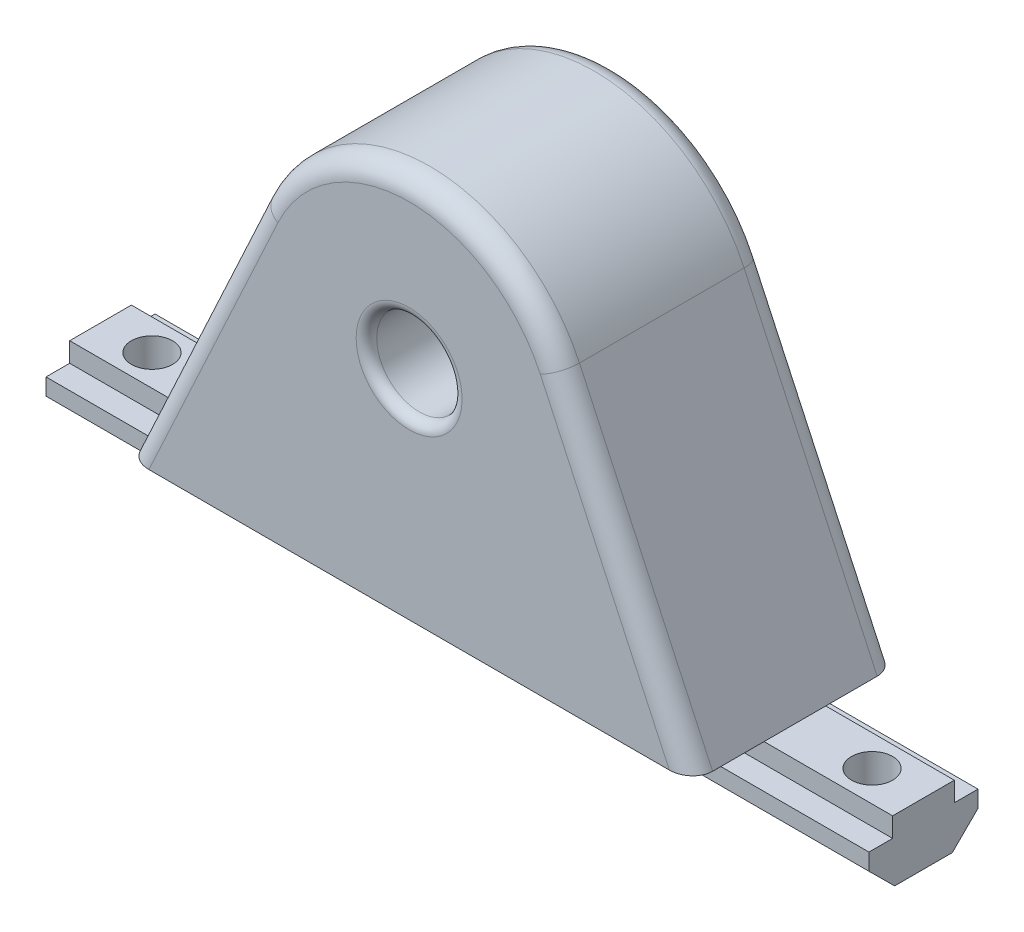
ISO-10303-21;
HEADER;
FILE_DESCRIPTION(('STEP AP214'),'2;1');
FILE_NAME('part.step','',(''),(''),'','','');
FILE_SCHEMA(('AUTOMOTIVE_DESIGN { 1 0 10303 214 1 1 1 1 }'));
ENDSEC;
DATA;
#1=APPLICATION_CONTEXT('core data for automotive mechanical design processes');
#2=APPLICATION_PROTOCOL_DEFINITION('international standard','automotive_design',2000,#1);
#3=PRODUCT_CONTEXT('',#1,'mechanical');
#4=PRODUCT('Part','Part','',(#3));
#5=PRODUCT_RELATED_PRODUCT_CATEGORY('part','',(#4));
#6=PRODUCT_DEFINITION_FORMATION('','',#4);
#7=PRODUCT_DEFINITION_CONTEXT('part definition',#1,'design');
#8=PRODUCT_DEFINITION('design','',#6,#7);
#9=PRODUCT_DEFINITION_SHAPE('','',#8);
#10=(LENGTH_UNIT() NAMED_UNIT(*) SI_UNIT(.MILLI.,.METRE.));
#11=(NAMED_UNIT(*) PLANE_ANGLE_UNIT() SI_UNIT($,.RADIAN.));
#12=(NAMED_UNIT(*) SI_UNIT($,.STERADIAN.) SOLID_ANGLE_UNIT());
#13=UNCERTAINTY_MEASURE_WITH_UNIT(LENGTH_MEASURE(1.E-05),#10,'distance_accuracy_value','');
#14=(GEOMETRIC_REPRESENTATION_CONTEXT(3) GLOBAL_UNCERTAINTY_ASSIGNED_CONTEXT((#13)) GLOBAL_UNIT_ASSIGNED_CONTEXT((#10,
#11,#12)) REPRESENTATION_CONTEXT('',''));
#15=CARTESIAN_POINT('',(0.,0.,0.));
#16=DIRECTION('',(0.,0.,1.));
#17=DIRECTION('',(1.,0.,0.));
#18=AXIS2_PLACEMENT_3D('',#15,#16,#17);
#19=CARTESIAN_POINT('',(40.,6.,3.));
#20=DIRECTION('',(0.,-1.,0.));
#21=DIRECTION('',(0.,0.,-1.));
#22=AXIS2_PLACEMENT_3D('',#19,#20,#21);
#23=PLANE('',#22);
#24=CARTESIAN_POINT('',(35.,6.,0.));
#25=DIRECTION('',(0.,1.,0.));
#26=DIRECTION('',(0.,0.,1.));
#27=AXIS2_PLACEMENT_3D('',#24,#25,#26);
#28=CIRCLE('',#27,2.);
#29=CARTESIAN_POINT('',(35.,6.,2.));
#30=VERTEX_POINT('',#29);
#31=EDGE_CURVE('E405',#30,#30,#28,.T.);
#32=ORIENTED_EDGE('',*,*,#31,.F.);
#33=EDGE_LOOP('',(#32));
#34=FACE_BOUND('',#33,.T.);
#35=DIRECTION('',(0.,0.,-1.));
#36=VECTOR('',#35,1.);
#37=CARTESIAN_POINT('',(27.5,6.,10.));
#38=LINE('',#37,#36);
#39=CARTESIAN_POINT('',(27.5,6.,3.));
#40=VERTEX_POINT('',#39);
#41=CARTESIAN_POINT('',(27.5,6.,-3.));
#42=VERTEX_POINT('',#41);
#43=EDGE_CURVE('E219',#40,#42,#38,.T.);
#44=ORIENTED_EDGE('',*,*,#43,.F.);
#45=DIRECTION('',(-1.,0.,0.));
#46=VECTOR('',#45,1.);
#47=CARTESIAN_POINT('',(40.,6.,3.));
#48=LINE('',#47,#46);
#49=CARTESIAN_POINT('',(40.,6.,3.));
#50=VERTEX_POINT('',#49);
#51=EDGE_CURVE('E227',#50,#40,#48,.T.);
#52=ORIENTED_EDGE('',*,*,#51,.F.);
#53=DIRECTION('',(0.,0.,1.));
#54=VECTOR('',#53,1.);
#55=CARTESIAN_POINT('',(40.,6.,3.));
#56=LINE('',#55,#54);
#57=CARTESIAN_POINT('',(40.,6.,-3.));
#58=VERTEX_POINT('',#57);
#59=EDGE_CURVE('E465',#58,#50,#56,.T.);
#60=ORIENTED_EDGE('',*,*,#59,.F.);
#61=DIRECTION('',(-1.,0.,0.));
#62=VECTOR('',#61,1.);
#63=CARTESIAN_POINT('',(40.,6.,-3.));
#64=LINE('',#63,#62);
#65=EDGE_CURVE('E209',#58,#42,#64,.T.);
#66=ORIENTED_EDGE('',*,*,#65,.T.);
#67=EDGE_LOOP('',(#44,#52,#60,#66));
#68=FACE_BOUND('',#67,.T.);
#69=ADVANCED_FACE('F43',(#34,#68),#23,.F.);
#70=CARTESIAN_POINT('',(40.,6.,3.));
#71=DIRECTION('',(0.,0.,-1.));
#72=DIRECTION('',(-1.,0.,0.));
#73=AXIS2_PLACEMENT_3D('',#70,#71,#72);
#74=PLANE('',#73);
#75=DIRECTION('',(0.,-1.,0.));
#76=VECTOR('',#75,1.);
#77=CARTESIAN_POINT('',(-40.,6.,3.));
#78=LINE('',#77,#76);
#79=CARTESIAN_POINT('',(-40.,6.,3.));
#80=VERTEX_POINT('',#79);
#81=CARTESIAN_POINT('',(-40.,4.1,3.));
#82=VERTEX_POINT('',#81);
#83=EDGE_CURVE('E435',#80,#82,#78,.T.);
#84=ORIENTED_EDGE('',*,*,#83,.T.);
#85=DIRECTION('',(-1.,0.,0.));
#86=VECTOR('',#85,1.);
#87=CARTESIAN_POINT('',(40.,4.1,3.));
#88=LINE('',#87,#86);
#89=CARTESIAN_POINT('',(40.,4.1,3.));
#90=VERTEX_POINT('',#89);
#91=EDGE_CURVE('E220',#90,#82,#88,.T.);
#92=ORIENTED_EDGE('',*,*,#91,.F.);
#93=DIRECTION('',(0.,-1.,0.));
#94=VECTOR('',#93,1.);
#95=CARTESIAN_POINT('',(40.,6.,3.));
#96=LINE('',#95,#94);
#97=EDGE_CURVE('E436',#50,#90,#96,.T.);
#98=ORIENTED_EDGE('',*,*,#97,.F.);
#99=ORIENTED_EDGE('',*,*,#51,.T.);
#100=CARTESIAN_POINT('',(-27.5,5.99999999999999,3.));
#101=VERTEX_POINT('',#100);
#102=EDGE_CURVE('E230',#40,#101,#48,.T.);
#103=ORIENTED_EDGE('',*,*,#102,.T.);
#104=EDGE_CURVE('E216',#101,#80,#48,.T.);
#105=ORIENTED_EDGE('',*,*,#104,.T.);
#106=EDGE_LOOP('',(#84,#92,#98,#99,#103,#105));
#107=FACE_BOUND('',#106,.T.);
#108=ADVANCED_FACE('F371',(#107),#74,.F.);
#109=CARTESIAN_POINT('',(40.,4.1,3.));
#110=DIRECTION('',(0.,-1.,0.));
#111=DIRECTION('',(0.,0.,-1.));
#112=AXIS2_PLACEMENT_3D('',#109,#110,#111);
#113=PLANE('',#112);
#114=DIRECTION('',(0.,0.,1.));
#115=VECTOR('',#114,1.);
#116=CARTESIAN_POINT('',(-40.,4.1,3.));
#117=LINE('',#116,#115);
#118=CARTESIAN_POINT('',(-40.,4.1,5.3));
#119=VERTEX_POINT('',#118);
#120=EDGE_CURVE('E471',#82,#119,#117,.T.);
#121=ORIENTED_EDGE('',*,*,#120,.T.);
#122=DIRECTION('',(-1.,0.,0.));
#123=VECTOR('',#122,1.);
#124=CARTESIAN_POINT('',(40.,4.1,5.3));
#125=LINE('',#124,#123);
#126=CARTESIAN_POINT('',(40.,4.1,5.3));
#127=VERTEX_POINT('',#126);
#128=EDGE_CURVE('E262',#127,#119,#125,.T.);
#129=ORIENTED_EDGE('',*,*,#128,.F.);
#130=DIRECTION('',(0.,0.,1.));
#131=VECTOR('',#130,1.);
#132=CARTESIAN_POINT('',(40.,4.1,3.));
#133=LINE('',#132,#131);
#134=EDGE_CURVE('E440',#90,#127,#133,.T.);
#135=ORIENTED_EDGE('',*,*,#134,.F.);
#136=ORIENTED_EDGE('',*,*,#91,.T.);
#137=EDGE_LOOP('',(#121,#129,#135,#136));
#138=FACE_BOUND('',#137,.T.);
#139=ADVANCED_FACE('F378',(#138),#113,.F.);
#140=CARTESIAN_POINT('',(40.,4.1,5.3));
#141=DIRECTION('',(0.,0.,-1.));
#142=DIRECTION('',(-1.,0.,0.));
#143=AXIS2_PLACEMENT_3D('',#140,#141,#142);
#144=PLANE('',#143);
#145=DIRECTION('',(0.,-1.,0.));
#146=VECTOR('',#145,1.);
#147=CARTESIAN_POINT('',(-40.,4.1,5.3));
#148=LINE('',#147,#146);
#149=CARTESIAN_POINT('',(-40.,2.48,5.3));
#150=VERTEX_POINT('',#149);
#151=EDGE_CURVE('E474',#119,#150,#148,.T.);
#152=ORIENTED_EDGE('',*,*,#151,.T.);
#153=DIRECTION('',(-1.,0.,0.));
#154=VECTOR('',#153,1.);
#155=CARTESIAN_POINT('',(40.,2.48,5.3));
#156=LINE('',#155,#154);
#157=CARTESIAN_POINT('',(40.,2.48,5.3));
#158=VERTEX_POINT('',#157);
#159=EDGE_CURVE('E258',#158,#150,#156,.T.);
#160=ORIENTED_EDGE('',*,*,#159,.F.);
#161=DIRECTION('',(0.,-1.,0.));
#162=VECTOR('',#161,1.);
#163=CARTESIAN_POINT('',(40.,4.1,5.3));
#164=LINE('',#163,#162);
#165=EDGE_CURVE('E444',#127,#158,#164,.T.);
#166=ORIENTED_EDGE('',*,*,#165,.F.);
#167=ORIENTED_EDGE('',*,*,#128,.T.);
#168=EDGE_LOOP('',(#152,#160,#166,#167));
#169=FACE_BOUND('',#168,.T.);
#170=ADVANCED_FACE('F682',(#169),#144,.F.);
#171=CARTESIAN_POINT('',(40.,0.,2.8));
#172=DIRECTION('',(0.,0.709940842242428,-0.704261315504488));
#173=DIRECTION('',(0.,0.704261315504488,0.709940842242428));
#174=AXIS2_PLACEMENT_3D('',#171,#172,#173);
#175=PLANE('',#174);
#176=DIRECTION('',(0.,-0.704261315504488,-0.709940842242428));
#177=VECTOR('',#176,1.);
#178=CARTESIAN_POINT('',(-40.,0.,2.8));
#179=LINE('',#178,#177);
#180=CARTESIAN_POINT('',(-40.,0.,2.8));
#181=VERTEX_POINT('',#180);
#182=EDGE_CURVE('E477',#150,#181,#179,.T.);
#183=ORIENTED_EDGE('',*,*,#182,.T.);
#184=DIRECTION('',(-1.,0.,0.));
#185=VECTOR('',#184,1.);
#186=CARTESIAN_POINT('',(40.,0.,2.8));
#187=LINE('',#186,#185);
#188=CARTESIAN_POINT('',(40.,0.,2.8));
#189=VERTEX_POINT('',#188);
#190=EDGE_CURVE('E254',#189,#181,#187,.T.);
#191=ORIENTED_EDGE('',*,*,#190,.F.);
#192=DIRECTION('',(0.,-0.704261315504488,-0.709940842242428));
#193=VECTOR('',#192,1.);
#194=CARTESIAN_POINT('',(40.,0.,2.8));
#195=LINE('',#194,#193);
#196=EDGE_CURVE('E447',#158,#189,#195,.T.);
#197=ORIENTED_EDGE('',*,*,#196,.F.);
#198=ORIENTED_EDGE('',*,*,#159,.T.);
#199=EDGE_LOOP('',(#183,#191,#197,#198));
#200=FACE_BOUND('',#199,.T.);
#201=ADVANCED_FACE('F686',(#200),#175,.F.);
#202=CARTESIAN_POINT('',(40.,0.,2.8));
#203=DIRECTION('',(0.,1.,0.));
#204=DIRECTION('',(0.,0.,1.));
#205=AXIS2_PLACEMENT_3D('',#202,#203,#204);
#206=PLANE('',#205);
#207=CARTESIAN_POINT('',(35.,0.,0.));
#208=DIRECTION('',(0.,1.,0.));
#209=DIRECTION('',(0.,0.,1.));
#210=AXIS2_PLACEMENT_3D('',#207,#208,#209);
#211=CIRCLE('',#210,2.);
#212=CARTESIAN_POINT('',(35.,0.,2.));
#213=VERTEX_POINT('',#212);
#214=EDGE_CURVE('E329',#213,#213,#211,.T.);
#215=ORIENTED_EDGE('',*,*,#214,.T.);
#216=EDGE_LOOP('',(#215));
#217=FACE_BOUND('',#216,.T.);
#218=CARTESIAN_POINT('',(-35.,0.,0.));
#219=DIRECTION('',(0.,1.,0.));
#220=DIRECTION('',(0.,0.,1.));
#221=AXIS2_PLACEMENT_3D('',#218,#219,#220);
#222=CIRCLE('',#221,2.);
#223=CARTESIAN_POINT('',(-35.,0.,2.));
#224=VERTEX_POINT('',#223);
#225=EDGE_CURVE('E401',#224,#224,#222,.T.);
#226=ORIENTED_EDGE('',*,*,#225,.T.);
#227=EDGE_LOOP('',(#226));
#228=FACE_BOUND('',#227,.T.);
#229=DIRECTION('',(0.,0.,-1.));
#230=VECTOR('',#229,1.);
#231=CARTESIAN_POINT('',(-40.,0.,2.8));
#232=LINE('',#231,#230);
#233=CARTESIAN_POINT('',(-40.,0.,-2.8));
#234=VERTEX_POINT('',#233);
#235=EDGE_CURVE('E480',#181,#234,#232,.T.);
#236=ORIENTED_EDGE('',*,*,#235,.T.);
#237=DIRECTION('',(-1.,0.,0.));
#238=VECTOR('',#237,1.);
#239=CARTESIAN_POINT('',(40.,0.,-2.8));
#240=LINE('',#239,#238);
#241=CARTESIAN_POINT('',(40.,0.,-2.8));
#242=VERTEX_POINT('',#241);
#243=EDGE_CURVE('E250',#242,#234,#240,.T.);
#244=ORIENTED_EDGE('',*,*,#243,.F.);
#245=DIRECTION('',(0.,0.,-1.));
#246=VECTOR('',#245,1.);
#247=CARTESIAN_POINT('',(40.,0.,2.8));
#248=LINE('',#247,#246);
#249=EDGE_CURVE('E450',#189,#242,#248,.T.);
#250=ORIENTED_EDGE('',*,*,#249,.F.);
#251=ORIENTED_EDGE('',*,*,#190,.T.);
#252=EDGE_LOOP('',(#236,#244,#250,#251));
#253=FACE_BOUND('',#252,.T.);
#254=ADVANCED_FACE('F690',(#217,#228,#253),#206,.F.);
#255=CARTESIAN_POINT('',(40.,0.,-2.8));
#256=DIRECTION('',(0.,0.709940842242428,0.704261315504488));
#257=DIRECTION('',(0.,-0.704261315504488,0.709940842242428));
#258=AXIS2_PLACEMENT_3D('',#255,#256,#257);
#259=PLANE('',#258);
#260=DIRECTION('',(0.,0.704261315504488,-0.709940842242428));
#261=VECTOR('',#260,1.);
#262=CARTESIAN_POINT('',(-40.,0.,-2.8));
#263=LINE('',#262,#261);
#264=CARTESIAN_POINT('',(-40.,2.48,-5.3));
#265=VERTEX_POINT('',#264);
#266=EDGE_CURVE('E483',#234,#265,#263,.T.);
#267=ORIENTED_EDGE('',*,*,#266,.T.);
#268=DIRECTION('',(-1.,0.,0.));
#269=VECTOR('',#268,1.);
#270=CARTESIAN_POINT('',(40.,2.48,-5.3));
#271=LINE('',#270,#269);
#272=CARTESIAN_POINT('',(40.,2.48,-5.3));
#273=VERTEX_POINT('',#272);
#274=EDGE_CURVE('E244',#273,#265,#271,.T.);
#275=ORIENTED_EDGE('',*,*,#274,.F.);
#276=DIRECTION('',(0.,0.704261315504488,-0.709940842242428));
#277=VECTOR('',#276,1.);
#278=CARTESIAN_POINT('',(40.,0.,-2.8));
#279=LINE('',#278,#277);
#280=EDGE_CURVE('E453',#242,#273,#279,.T.);
#281=ORIENTED_EDGE('',*,*,#280,.F.);
#282=ORIENTED_EDGE('',*,*,#243,.T.);
#283=EDGE_LOOP('',(#267,#275,#281,#282));
#284=FACE_BOUND('',#283,.T.);
#285=ADVANCED_FACE('F693',(#284),#259,.F.);
#286=CARTESIAN_POINT('',(40.,4.1,-5.3));
#287=DIRECTION('',(0.,0.,1.));
#288=DIRECTION('',(1.,0.,0.));
#289=AXIS2_PLACEMENT_3D('',#286,#287,#288);
#290=PLANE('',#289);
#291=DIRECTION('',(0.,1.,0.));
#292=VECTOR('',#291,1.);
#293=CARTESIAN_POINT('',(-40.,4.1,-5.3));
#294=LINE('',#293,#292);
#295=CARTESIAN_POINT('',(-40.,4.1,-5.3));
#296=VERTEX_POINT('',#295);
#297=EDGE_CURVE('E486',#265,#296,#294,.T.);
#298=ORIENTED_EDGE('',*,*,#297,.T.);
#299=DIRECTION('',(-1.,0.,0.));
#300=VECTOR('',#299,1.);
#301=CARTESIAN_POINT('',(40.,4.1,-5.3));
#302=LINE('',#301,#300);
#303=CARTESIAN_POINT('',(40.,4.1,-5.3));
#304=VERTEX_POINT('',#303);
#305=EDGE_CURVE('E239',#304,#296,#302,.T.);
#306=ORIENTED_EDGE('',*,*,#305,.F.);
#307=DIRECTION('',(0.,1.,0.));
#308=VECTOR('',#307,1.);
#309=CARTESIAN_POINT('',(40.,4.1,-5.3));
#310=LINE('',#309,#308);
#311=EDGE_CURVE('E456',#273,#304,#310,.T.);
#312=ORIENTED_EDGE('',*,*,#311,.F.);
#313=ORIENTED_EDGE('',*,*,#274,.T.);
#314=EDGE_LOOP('',(#298,#306,#312,#313));
#315=FACE_BOUND('',#314,.T.);
#316=ADVANCED_FACE('F697',(#315),#290,.F.);
#317=CARTESIAN_POINT('',(40.,4.1,-3.));
#318=DIRECTION('',(0.,-1.,0.));
#319=DIRECTION('',(0.,0.,-1.));
#320=AXIS2_PLACEMENT_3D('',#317,#318,#319);
#321=PLANE('',#320);
#322=DIRECTION('',(0.,0.,1.));
#323=VECTOR('',#322,1.);
#324=CARTESIAN_POINT('',(-40.,4.1,-3.));
#325=LINE('',#324,#323);
#326=CARTESIAN_POINT('',(-40.,4.1,-3.));
#327=VERTEX_POINT('',#326);
#328=EDGE_CURVE('E489',#296,#327,#325,.T.);
#329=ORIENTED_EDGE('',*,*,#328,.T.);
#330=DIRECTION('',(-1.,0.,0.));
#331=VECTOR('',#330,1.);
#332=CARTESIAN_POINT('',(40.,4.1,-3.));
#333=LINE('',#332,#331);
#334=CARTESIAN_POINT('',(40.,4.1,-3.));
#335=VERTEX_POINT('',#334);
#336=EDGE_CURVE('E234',#335,#327,#333,.T.);
#337=ORIENTED_EDGE('',*,*,#336,.F.);
#338=DIRECTION('',(0.,0.,1.));
#339=VECTOR('',#338,1.);
#340=CARTESIAN_POINT('',(40.,4.1,-3.));
#341=LINE('',#340,#339);
#342=EDGE_CURVE('E459',#304,#335,#341,.T.);
#343=ORIENTED_EDGE('',*,*,#342,.F.);
#344=ORIENTED_EDGE('',*,*,#305,.T.);
#345=EDGE_LOOP('',(#329,#337,#343,#344));
#346=FACE_BOUND('',#345,.T.);
#347=ADVANCED_FACE('F395',(#346),#321,.F.);
#348=CARTESIAN_POINT('',(40.,6.,-3.));
#349=DIRECTION('',(0.,0.,1.));
#350=DIRECTION('',(0.,-1.,0.));
#351=AXIS2_PLACEMENT_3D('',#348,#349,#350);
#352=PLANE('',#351);
#353=DIRECTION('',(0.,1.,0.));
#354=VECTOR('',#353,1.);
#355=CARTESIAN_POINT('',(-40.,6.,-3.));
#356=LINE('',#355,#354);
#357=CARTESIAN_POINT('',(-40.,6.,-3.));
#358=VERTEX_POINT('',#357);
#359=EDGE_CURVE('E224',#327,#358,#356,.T.);
#360=ORIENTED_EDGE('',*,*,#359,.T.);
#361=CARTESIAN_POINT('',(-27.5,5.99999999999999,-3.));
#362=VERTEX_POINT('',#361);
#363=EDGE_CURVE('E210',#362,#358,#64,.T.);
#364=ORIENTED_EDGE('',*,*,#363,.F.);
#365=EDGE_CURVE('E200',#42,#362,#64,.T.);
#366=ORIENTED_EDGE('',*,*,#365,.F.);
#367=ORIENTED_EDGE('',*,*,#65,.F.);
#368=DIRECTION('',(0.,1.,0.));
#369=VECTOR('',#368,1.);
#370=CARTESIAN_POINT('',(40.,6.,-3.));
#371=LINE('',#370,#369);
#372=EDGE_CURVE('E462',#335,#58,#371,.T.);
#373=ORIENTED_EDGE('',*,*,#372,.F.);
#374=ORIENTED_EDGE('',*,*,#336,.T.);
#375=EDGE_LOOP('',(#360,#364,#366,#367,#373,#374));
#376=FACE_BOUND('',#375,.T.);
#377=ADVANCED_FACE('F221',(#376),#352,.F.);
#378=CARTESIAN_POINT('',(-35.,6.,0.));
#379=DIRECTION('',(0.,1.,0.));
#380=DIRECTION('',(0.,0.,1.));
#381=AXIS2_PLACEMENT_3D('',#378,#379,#380);
#382=CIRCLE('',#381,2.);
#383=CARTESIAN_POINT('',(-35.,6.,2.));
#384=VERTEX_POINT('',#383);
#385=EDGE_CURVE('E398',#384,#384,#382,.T.);
#386=ORIENTED_EDGE('',*,*,#385,.F.);
#387=EDGE_LOOP('',(#386));
#388=FACE_BOUND('',#387,.T.);
#389=ORIENTED_EDGE('',*,*,#104,.F.);
#390=DIRECTION('',(0.,0.,-1.));
#391=VECTOR('',#390,1.);
#392=CARTESIAN_POINT('',(-27.5,5.99999999999999,10.));
#393=LINE('',#392,#391);
#394=EDGE_CURVE('E188',#101,#362,#393,.T.);
#395=ORIENTED_EDGE('',*,*,#394,.T.);
#396=ORIENTED_EDGE('',*,*,#363,.T.);
#397=DIRECTION('',(0.,0.,1.));
#398=VECTOR('',#397,1.);
#399=CARTESIAN_POINT('',(-40.,6.,3.));
#400=LINE('',#399,#398);
#401=EDGE_CURVE('E441',#358,#80,#400,.T.);
#402=ORIENTED_EDGE('',*,*,#401,.T.);
#403=EDGE_LOOP('',(#389,#395,#396,#402));
#404=FACE_BOUND('',#403,.T.);
#405=ADVANCED_FACE('F213',(#388,#404),#23,.F.);
#406=CARTESIAN_POINT('',(40.,0.,0.));
#407=DIRECTION('',(-1.,0.,0.));
#408=DIRECTION('',(0.,0.,1.));
#409=AXIS2_PLACEMENT_3D('',#406,#407,#408);
#410=PLANE('',#409);
#411=ORIENTED_EDGE('',*,*,#97,.T.);
#412=ORIENTED_EDGE('',*,*,#134,.T.);
#413=ORIENTED_EDGE('',*,*,#165,.T.);
#414=ORIENTED_EDGE('',*,*,#196,.T.);
#415=ORIENTED_EDGE('',*,*,#249,.T.);
#416=ORIENTED_EDGE('',*,*,#280,.T.);
#417=ORIENTED_EDGE('',*,*,#311,.T.);
#418=ORIENTED_EDGE('',*,*,#342,.T.);
#419=ORIENTED_EDGE('',*,*,#372,.T.);
#420=ORIENTED_EDGE('',*,*,#59,.T.);
#421=EDGE_LOOP('',(#411,#412,#413,#414,#415,#416,#417,#418,#419,#420));
#422=FACE_BOUND('',#421,.T.);
#423=ADVANCED_FACE('F385',(#422),#410,.F.);
#424=CARTESIAN_POINT('',(-40.,0.,0.));
#425=DIRECTION('',(-1.,0.,0.));
#426=DIRECTION('',(0.,0.,1.));
#427=AXIS2_PLACEMENT_3D('',#424,#425,#426);
#428=PLANE('',#427);
#429=ORIENTED_EDGE('',*,*,#83,.F.);
#430=ORIENTED_EDGE('',*,*,#401,.F.);
#431=ORIENTED_EDGE('',*,*,#359,.F.);
#432=ORIENTED_EDGE('',*,*,#328,.F.);
#433=ORIENTED_EDGE('',*,*,#297,.F.);
#434=ORIENTED_EDGE('',*,*,#266,.F.);
#435=ORIENTED_EDGE('',*,*,#235,.F.);
#436=ORIENTED_EDGE('',*,*,#182,.F.);
#437=ORIENTED_EDGE('',*,*,#151,.F.);
#438=ORIENTED_EDGE('',*,*,#120,.F.);
#439=EDGE_LOOP('',(#429,#430,#431,#432,#433,#434,#435,#436,#437,#438));
#440=FACE_BOUND('',#439,.T.);
#441=ADVANCED_FACE('F391',(#440),#428,.T.);
#442=CARTESIAN_POINT('',(27.5,6.,10.));
#443=DIRECTION('',(0.,1.,0.));
#444=DIRECTION('',(-1.,0.,0.));
#445=AXIS2_PLACEMENT_3D('',#442,#443,#444);
#446=PLANE('',#445);
#447=CARTESIAN_POINT('',(-27.5,5.99999999999999,-8.));
#448=VERTEX_POINT('',#447);
#449=EDGE_CURVE('E183',#362,#448,#393,.T.);
#450=ORIENTED_EDGE('',*,*,#449,.T.);
#451=CARTESIAN_POINT('',(-25.2954077045284,5.99999999999999,-8.));
#452=DIRECTION('',(0.,1.,0.));
#453=DIRECTION('',(-1.,0.,0.));
#454=AXIS2_PLACEMENT_3D('',#451,#452,#453);
#455=ELLIPSE('',#454,2.20459229547155,2.);
#456=CARTESIAN_POINT('',(-25.2954077045284,5.99999999999999,-10.));
#457=VERTEX_POINT('',#456);
#458=EDGE_CURVE('E313',#448,#457,#455,.F.);
#459=ORIENTED_EDGE('',*,*,#458,.T.);
#460=DIRECTION('',(1.,0.,0.));
#461=VECTOR('',#460,1.);
#462=CARTESIAN_POINT('',(27.5,6.,-10.));
#463=LINE('',#462,#461);
#464=CARTESIAN_POINT('',(25.2954077045285,6.,-10.));
#465=VERTEX_POINT('',#464);
#466=EDGE_CURVE('E421',#457,#465,#463,.T.);
#467=ORIENTED_EDGE('',*,*,#466,.T.);
#468=CARTESIAN_POINT('',(25.2954077045285,6.,-8.));
#469=DIRECTION('',(0.,1.,0.));
#470=DIRECTION('',(-1.,0.,0.));
#471=AXIS2_PLACEMENT_3D('',#468,#469,#470);
#472=ELLIPSE('',#471,2.20459229547155,2.);
#473=CARTESIAN_POINT('',(27.5,6.,-8.));
#474=VERTEX_POINT('',#473);
#475=EDGE_CURVE('E310',#465,#474,#472,.F.);
#476=ORIENTED_EDGE('',*,*,#475,.T.);
#477=EDGE_CURVE('E203',#42,#474,#38,.T.);
#478=ORIENTED_EDGE('',*,*,#477,.F.);
#479=ORIENTED_EDGE('',*,*,#365,.T.);
#480=EDGE_LOOP('',(#450,#459,#467,#476,#478,#479));
#481=FACE_BOUND('',#480,.T.);
#482=ADVANCED_FACE('F201',(#481),#446,.F.);
#483=CARTESIAN_POINT('',(27.5,6.,8.));
#484=VERTEX_POINT('',#483);
#485=EDGE_CURVE('E196',#484,#40,#38,.T.);
#486=ORIENTED_EDGE('',*,*,#485,.F.);
#487=CARTESIAN_POINT('',(25.2954077045285,5.99999999999999,8.));
#488=DIRECTION('',(0.,1.,0.));
#489=DIRECTION('',(1.,0.,0.));
#490=AXIS2_PLACEMENT_3D('',#487,#488,#489);
#491=ELLIPSE('',#490,2.20459229547155,2.);
#492=CARTESIAN_POINT('',(25.2954077045285,6.,10.));
#493=VERTEX_POINT('',#492);
#494=EDGE_CURVE('E279',#484,#493,#491,.F.);
#495=ORIENTED_EDGE('',*,*,#494,.T.);
#496=DIRECTION('',(1.,0.,0.));
#497=VECTOR('',#496,1.);
#498=CARTESIAN_POINT('',(27.5,6.,10.));
#499=LINE('',#498,#497);
#500=CARTESIAN_POINT('',(-25.2954077045284,5.99999999999999,10.));
#501=VERTEX_POINT('',#500);
#502=EDGE_CURVE('E425',#501,#493,#499,.T.);
#503=ORIENTED_EDGE('',*,*,#502,.F.);
#504=CARTESIAN_POINT('',(-25.2954077045284,5.99999999999999,8.));
#505=DIRECTION('',(0.,1.,0.));
#506=DIRECTION('',(1.,0.,0.));
#507=AXIS2_PLACEMENT_3D('',#504,#505,#506);
#508=ELLIPSE('',#507,2.20459229547155,2.);
#509=CARTESIAN_POINT('',(-27.5,5.99999999999999,8.));
#510=VERTEX_POINT('',#509);
#511=EDGE_CURVE('E276',#501,#510,#508,.F.);
#512=ORIENTED_EDGE('',*,*,#511,.T.);
#513=EDGE_CURVE('E195',#510,#101,#393,.T.);
#514=ORIENTED_EDGE('',*,*,#513,.T.);
#515=ORIENTED_EDGE('',*,*,#102,.F.);
#516=EDGE_LOOP('',(#486,#495,#503,#512,#514,#515));
#517=FACE_BOUND('',#516,.T.);
#518=ADVANCED_FACE('F506',(#517),#446,.F.);
#519=CARTESIAN_POINT('',(0.,0.,10.));
#520=DIRECTION('',(0.,0.,-1.));
#521=DIRECTION('',(-1.,0.,0.));
#522=AXIS2_PLACEMENT_3D('',#519,#520,#521);
#523=PLANE('',#522);
#524=CARTESIAN_POINT('',(0.,27.15,10.));
#525=DIRECTION('',(0.,0.,-1.));
#526=DIRECTION('',(-1.,0.,0.));
#527=AXIS2_PLACEMENT_3D('',#524,#525,#526);
#528=CIRCLE('',#527,5.15);
#529=CARTESIAN_POINT('',(-5.15,27.15,10.));
#530=VERTEX_POINT('',#529);
#531=EDGE_CURVE('E11',#530,#530,#528,.T.);
#532=ORIENTED_EDGE('',*,*,#531,.T.);
#533=EDGE_LOOP('',(#532));
#534=FACE_BOUND('',#533,.T.);
#535=ORIENTED_EDGE('',*,*,#502,.T.);
#536=DIRECTION('',(0.420705604207036,-0.907197219235593,0.));
#537=VECTOR('',#536,1.);
#538=CARTESIAN_POINT('',(23.1082701382413,10.7162792660231,10.));
#539=LINE('',#538,#537);
#540=CARTESIAN_POINT('',(12.7461209302601,33.0609137391089,10.));
#541=VERTEX_POINT('',#540);
#542=EDGE_CURVE('E288',#493,#541,#539,.F.);
#543=ORIENTED_EDGE('',*,*,#542,.T.);
#544=CARTESIAN_POINT('',(0.,27.15,10.));
#545=DIRECTION('',(0.,0.,-1.));
#546=DIRECTION('',(-1.,0.,0.));
#547=AXIS2_PLACEMENT_3D('',#544,#545,#546);
#548=CIRCLE('',#547,14.05);
#549=CARTESIAN_POINT('',(-12.7461209302601,33.0609137391088,10.));
#550=VERTEX_POINT('',#549);
#551=EDGE_CURVE('E285',#541,#550,#548,.F.);
#552=ORIENTED_EDGE('',*,*,#551,.T.);
#553=DIRECTION('',(0.420705604207035,0.907197219235593,0.));
#554=VECTOR('',#553,1.);
#555=CARTESIAN_POINT('',(-23.1082701382413,10.7162792660231,10.));
#556=LINE('',#555,#554);
#557=EDGE_CURVE('E282',#550,#501,#556,.F.);
#558=ORIENTED_EDGE('',*,*,#557,.T.);
#559=EDGE_LOOP('',(#535,#543,#552,#558));
#560=FACE_BOUND('',#559,.T.);
#561=ADVANCED_FACE('F525',(#534,#560),#523,.F.);
#562=CARTESIAN_POINT('',(0.,0.,-10.));
#563=DIRECTION('',(0.,0.,-1.));
#564=DIRECTION('',(-1.,0.,0.));
#565=AXIS2_PLACEMENT_3D('',#562,#563,#564);
#566=PLANE('',#565);
#567=CARTESIAN_POINT('',(0.,27.15,-10.));
#568=DIRECTION('',(0.,0.,1.));
#569=DIRECTION('',(1.,0.,0.));
#570=AXIS2_PLACEMENT_3D('',#567,#568,#569);
#571=CIRCLE('',#570,11.05);
#572=CARTESIAN_POINT('',(11.05,27.15,-10.));
#573=VERTEX_POINT('',#572);
#574=EDGE_CURVE('E409',#573,#573,#571,.T.);
#575=ORIENTED_EDGE('',*,*,#574,.T.);
#576=EDGE_LOOP('',(#575));
#577=FACE_BOUND('',#576,.T.);
#578=ORIENTED_EDGE('',*,*,#466,.F.);
#579=DIRECTION('',(0.420705604207035,0.907197219235593,0.));
#580=VECTOR('',#579,1.);
#581=CARTESIAN_POINT('',(-12.7461209302601,33.0609137391088,-10.));
#582=LINE('',#581,#580);
#583=CARTESIAN_POINT('',(-12.7461209302601,33.0609137391088,-10.));
#584=VERTEX_POINT('',#583);
#585=EDGE_CURVE('E307',#457,#584,#582,.T.);
#586=ORIENTED_EDGE('',*,*,#585,.T.);
#587=CARTESIAN_POINT('',(0.,27.15,-10.));
#588=DIRECTION('',(0.,0.,-1.));
#589=DIRECTION('',(-1.,0.,0.));
#590=AXIS2_PLACEMENT_3D('',#587,#588,#589);
#591=CIRCLE('',#590,14.05);
#592=CARTESIAN_POINT('',(12.7461209302601,33.0609137391089,-10.));
#593=VERTEX_POINT('',#592);
#594=EDGE_CURVE('E66',#584,#593,#591,.T.);
#595=ORIENTED_EDGE('',*,*,#594,.T.);
#596=DIRECTION('',(0.420705604207036,-0.907197219235593,0.));
#597=VECTOR('',#596,1.);
#598=CARTESIAN_POINT('',(25.6856055615288,5.15858879158592,-10.));
#599=LINE('',#598,#597);
#600=EDGE_CURVE('E302',#593,#465,#599,.T.);
#601=ORIENTED_EDGE('',*,*,#600,.T.);
#602=EDGE_LOOP('',(#578,#586,#595,#601));
#603=FACE_BOUND('',#602,.T.);
#604=ADVANCED_FACE('F356',(#577,#603),#566,.T.);
#605=CARTESIAN_POINT('',(0.,27.15,-10.));
#606=DIRECTION('',(0.,0.,1.));
#607=DIRECTION('',(1.,0.,0.));
#608=AXIS2_PLACEMENT_3D('',#605,#606,#607);
#609=CYLINDRICAL_SURFACE('',#608,4.15);
#610=CARTESIAN_POINT('',(0.,27.15,0.999999999999999));
#611=DIRECTION('',(0.,0.,1.));
#612=DIRECTION('',(1.,0.,0.));
#613=AXIS2_PLACEMENT_3D('',#610,#611,#612);
#614=CIRCLE('',#613,4.15);
#615=CARTESIAN_POINT('',(4.15,27.15,0.999999999999999));
#616=VERTEX_POINT('',#615);
#617=EDGE_CURVE('E336',#616,#616,#614,.F.);
#618=ORIENTED_EDGE('',*,*,#617,.T.);
#619=EDGE_LOOP('',(#618));
#620=FACE_BOUND('',#619,.T.);
#621=CARTESIAN_POINT('',(0.,27.15,9.));
#622=DIRECTION('',(0.,0.,-1.));
#623=DIRECTION('',(-1.,0.,0.));
#624=AXIS2_PLACEMENT_3D('',#621,#622,#623);
#625=CIRCLE('',#624,4.15);
#626=CARTESIAN_POINT('',(-4.15,27.15,9.));
#627=VERTEX_POINT('',#626);
#628=EDGE_CURVE('E316',#627,#627,#625,.F.);
#629=ORIENTED_EDGE('',*,*,#628,.T.);
#630=EDGE_LOOP('',(#629));
#631=FACE_BOUND('',#630,.T.);
#632=ADVANCED_FACE('F352',(#620,#631),#609,.F.);
#633=CARTESIAN_POINT('',(27.5,6.,-10.));
#634=DIRECTION('',(-0.907197219235593,-0.420705604207036,0.));
#635=DIRECTION('',(0.420705604207036,-0.907197219235593,0.));
#636=AXIS2_PLACEMENT_3D('',#633,#634,#635);
#637=PLANE('',#636);
#638=DIRECTION('',(0.,0.,1.));
#639=VECTOR('',#638,1.);
#640=CARTESIAN_POINT('',(14.5605153687313,33.9023249475229,-10.));
#641=LINE('',#640,#639);
#642=CARTESIAN_POINT('',(14.5605153687313,33.9023249475229,-8.));
#643=VERTEX_POINT('',#642);
#644=CARTESIAN_POINT('',(14.5605153687313,33.9023249475229,8.));
#645=VERTEX_POINT('',#644);
#646=EDGE_CURVE('E417',#643,#645,#641,.T.);
#647=ORIENTED_EDGE('',*,*,#646,.T.);
#648=DIRECTION('',(0.420705604207036,-0.907197219235593,0.));
#649=VECTOR('',#648,1.);
#650=CARTESIAN_POINT('',(27.5,6.,8.));
#651=LINE('',#650,#649);
#652=EDGE_CURVE('E272',#645,#484,#651,.T.);
#653=ORIENTED_EDGE('',*,*,#652,.T.);
#654=ORIENTED_EDGE('',*,*,#485,.T.);
#655=ORIENTED_EDGE('',*,*,#43,.T.);
#656=ORIENTED_EDGE('',*,*,#477,.T.);
#657=DIRECTION('',(0.420705604207036,-0.907197219235593,0.));
#658=VECTOR('',#657,1.);
#659=CARTESIAN_POINT('',(14.5605153687313,33.9023249475229,-8.));
#660=LINE('',#659,#658);
#661=EDGE_CURVE('E269',#474,#643,#660,.F.);
#662=ORIENTED_EDGE('',*,*,#661,.T.);
#663=EDGE_LOOP('',(#647,#653,#654,#655,#656,#662));
#664=FACE_BOUND('',#663,.T.);
#665=ADVANCED_FACE('F355',(#664),#637,.F.);
#666=CARTESIAN_POINT('',(0.,27.15,-10.));
#667=DIRECTION('',(0.,0.,1.));
#668=DIRECTION('',(1.,0.,0.));
#669=AXIS2_PLACEMENT_3D('',#666,#667,#668);
#670=CYLINDRICAL_SURFACE('',#669,16.05);
#671=DIRECTION('',(0.,0.,1.));
#672=VECTOR('',#671,1.);
#673=CARTESIAN_POINT('',(-14.5605153687313,33.9023249475229,-10.));
#674=LINE('',#673,#672);
#675=CARTESIAN_POINT('',(-14.5605153687313,33.9023249475229,-8.));
#676=VERTEX_POINT('',#675);
#677=CARTESIAN_POINT('',(-14.5605153687313,33.9023249475229,8.));
#678=VERTEX_POINT('',#677);
#679=EDGE_CURVE('E413',#676,#678,#674,.T.);
#680=ORIENTED_EDGE('',*,*,#679,.T.);
#681=CARTESIAN_POINT('',(0.,27.15,8.));
#682=DIRECTION('',(0.,0.,-1.));
#683=DIRECTION('',(-1.,0.,0.));
#684=AXIS2_PLACEMENT_3D('',#681,#682,#683);
#685=CIRCLE('',#684,16.05);
#686=EDGE_CURVE('E294',#678,#645,#685,.T.);
#687=ORIENTED_EDGE('',*,*,#686,.T.);
#688=ORIENTED_EDGE('',*,*,#646,.F.);
#689=CARTESIAN_POINT('',(0.,27.15,-8.));
#690=DIRECTION('',(0.,0.,-1.));
#691=DIRECTION('',(-1.,0.,0.));
#692=AXIS2_PLACEMENT_3D('',#689,#690,#691);
#693=CIRCLE('',#692,16.05);
#694=EDGE_CURVE('E291',#643,#676,#693,.F.);
#695=ORIENTED_EDGE('',*,*,#694,.T.);
#696=EDGE_LOOP('',(#680,#687,#688,#695));
#697=FACE_BOUND('',#696,.T.);
#698=ADVANCED_FACE('F520',(#697),#670,.T.);
#699=CARTESIAN_POINT('',(-27.5,5.99999999999999,-10.));
#700=DIRECTION('',(0.907197219235593,-0.420705604207035,0.));
#701=DIRECTION('',(0.420705604207035,0.907197219235593,0.));
#702=AXIS2_PLACEMENT_3D('',#699,#700,#701);
#703=PLANE('',#702);
#704=ORIENTED_EDGE('',*,*,#513,.F.);
#705=DIRECTION('',(0.420705604207035,0.907197219235593,0.));
#706=VECTOR('',#705,1.);
#707=CARTESIAN_POINT('',(-27.5,5.99999999999999,8.));
#708=LINE('',#707,#706);
#709=EDGE_CURVE('E299',#510,#678,#708,.T.);
#710=ORIENTED_EDGE('',*,*,#709,.T.);
#711=ORIENTED_EDGE('',*,*,#679,.F.);
#712=DIRECTION('',(0.420705604207035,0.907197219235593,0.));
#713=VECTOR('',#712,1.);
#714=CARTESIAN_POINT('',(-27.5,5.99999999999998,-8.));
#715=LINE('',#714,#713);
#716=EDGE_CURVE('E191',#676,#448,#715,.F.);
#717=ORIENTED_EDGE('',*,*,#716,.T.);
#718=ORIENTED_EDGE('',*,*,#449,.F.);
#719=ORIENTED_EDGE('',*,*,#394,.F.);
#720=EDGE_LOOP('',(#704,#710,#711,#717,#718,#719));
#721=FACE_BOUND('',#720,.T.);
#722=ADVANCED_FACE('F186',(#721),#703,.F.);
#723=CARTESIAN_POINT('',(0.,27.15,0.));
#724=DIRECTION('',(0.,0.,1.));
#725=DIRECTION('',(1.,0.,0.));
#726=AXIS2_PLACEMENT_3D('',#723,#724,#725);
#727=PLANE('',#726);
#728=CARTESIAN_POINT('',(0.,27.15,0.));
#729=DIRECTION('',(0.,0.,1.));
#730=DIRECTION('',(1.,0.,0.));
#731=AXIS2_PLACEMENT_3D('',#728,#729,#730);
#732=CIRCLE('',#731,5.15);
#733=CARTESIAN_POINT('',(5.15,27.15,0.));
#734=VERTEX_POINT('',#733);
#735=EDGE_CURVE('E52',#734,#734,#732,.T.);
#736=ORIENTED_EDGE('',*,*,#735,.T.);
#737=EDGE_LOOP('',(#736));
#738=FACE_BOUND('',#737,.T.);
#739=CARTESIAN_POINT('',(0.,27.15,0.));
#740=DIRECTION('',(0.,0.,1.));
#741=DIRECTION('',(1.,0.,0.));
#742=AXIS2_PLACEMENT_3D('',#739,#740,#741);
#743=CIRCLE('',#742,11.05);
#744=CARTESIAN_POINT('',(11.05,27.15,0.));
#745=VERTEX_POINT('',#744);
#746=EDGE_CURVE('E326',#745,#745,#743,.T.);
#747=ORIENTED_EDGE('',*,*,#746,.F.);
#748=EDGE_LOOP('',(#747));
#749=FACE_BOUND('',#748,.T.);
#750=ADVANCED_FACE('F343',(#738,#749),#727,.F.);
#751=CARTESIAN_POINT('',(0.,27.15,-10.));
#752=DIRECTION('',(0.,0.,1.));
#753=DIRECTION('',(1.,0.,0.));
#754=AXIS2_PLACEMENT_3D('',#751,#752,#753);
#755=CYLINDRICAL_SURFACE('',#754,11.05);
#756=ORIENTED_EDGE('',*,*,#574,.F.);
#757=EDGE_LOOP('',(#756));
#758=FACE_BOUND('',#757,.T.);
#759=ORIENTED_EDGE('',*,*,#746,.T.);
#760=EDGE_LOOP('',(#759));
#761=FACE_BOUND('',#760,.T.);
#762=ADVANCED_FACE('F573',(#758,#761),#755,.F.);
#763=CARTESIAN_POINT('',(-25.6856055615288,5.15858879158591,8.));
#764=DIRECTION('',(0.420705604207035,0.907197219235593,0.));
#765=DIRECTION('',(-0.907197219235593,0.420705604207035,0.));
#766=AXIS2_PLACEMENT_3D('',#763,#764,#765);
#767=CYLINDRICAL_SURFACE('',#766,2.);
#768=ORIENTED_EDGE('',*,*,#511,.F.);
#769=ORIENTED_EDGE('',*,*,#557,.F.);
#770=CARTESIAN_POINT('',(-12.7461209302601,33.0609137391088,8.));
#771=DIRECTION('',(0.420705604207036,0.907197219235593,0.));
#772=DIRECTION('',(-0.907197219235593,0.420705604207036,0.));
#773=AXIS2_PLACEMENT_3D('',#770,#771,#772);
#774=CIRCLE('',#773,2.);
#775=EDGE_CURVE('E321',#678,#550,#774,.T.);
#776=ORIENTED_EDGE('',*,*,#775,.F.);
#777=ORIENTED_EDGE('',*,*,#709,.F.);
#778=EDGE_LOOP('',(#768,#769,#776,#777));
#779=FACE_BOUND('',#778,.T.);
#780=ADVANCED_FACE('F609',(#779),#767,.T.);
#781=CARTESIAN_POINT('',(0.,27.15,8.));
#782=DIRECTION('',(0.,0.,-1.));
#783=DIRECTION('',(-1.,0.,0.));
#784=AXIS2_PLACEMENT_3D('',#781,#782,#783);
#785=TOROIDAL_SURFACE('',#784,14.05,2.);
#786=ORIENTED_EDGE('',*,*,#775,.T.);
#787=ORIENTED_EDGE('',*,*,#551,.F.);
#788=CARTESIAN_POINT('',(12.7461209302601,33.0609137391089,8.));
#789=DIRECTION('',(0.420705604207036,-0.907197219235593,0.));
#790=DIRECTION('',(0.907197219235593,0.420705604207036,0.));
#791=AXIS2_PLACEMENT_3D('',#788,#789,#790);
#792=CIRCLE('',#791,2.);
#793=EDGE_CURVE('E317',#645,#541,#792,.T.);
#794=ORIENTED_EDGE('',*,*,#793,.F.);
#795=ORIENTED_EDGE('',*,*,#686,.F.);
#796=EDGE_LOOP('',(#786,#787,#794,#795));
#797=FACE_BOUND('',#796,.T.);
#798=ADVANCED_FACE('F638',(#797),#785,.T.);
#799=CARTESIAN_POINT('',(25.6856055615288,5.15858879158592,8.));
#800=DIRECTION('',(0.420705604207036,-0.907197219235593,0.));
#801=DIRECTION('',(0.907197219235593,0.420705604207036,0.));
#802=AXIS2_PLACEMENT_3D('',#799,#800,#801);
#803=CYLINDRICAL_SURFACE('',#802,2.);
#804=ORIENTED_EDGE('',*,*,#793,.T.);
#805=ORIENTED_EDGE('',*,*,#542,.F.);
#806=ORIENTED_EDGE('',*,*,#494,.F.);
#807=ORIENTED_EDGE('',*,*,#652,.F.);
#808=EDGE_LOOP('',(#804,#805,#806,#807));
#809=FACE_BOUND('',#808,.T.);
#810=ADVANCED_FACE('F648',(#809),#803,.T.);
#811=CARTESIAN_POINT('',(23.1082701382413,10.7162792660231,-8.));
#812=DIRECTION('',(-0.420705604207036,0.907197219235593,0.));
#813=DIRECTION('',(-0.907197219235593,-0.420705604207036,0.));
#814=AXIS2_PLACEMENT_3D('',#811,#812,#813);
#815=CYLINDRICAL_SURFACE('',#814,2.);
#816=ORIENTED_EDGE('',*,*,#475,.F.);
#817=ORIENTED_EDGE('',*,*,#600,.F.);
#818=CARTESIAN_POINT('',(12.7461209302601,33.0609137391089,-8.));
#819=DIRECTION('',(-0.420705604207035,0.907197219235593,0.));
#820=DIRECTION('',(-0.907197219235593,-0.420705604207035,0.));
#821=AXIS2_PLACEMENT_3D('',#818,#819,#820);
#822=CIRCLE('',#821,2.);
#823=EDGE_CURVE('E322',#643,#593,#822,.T.);
#824=ORIENTED_EDGE('',*,*,#823,.F.);
#825=ORIENTED_EDGE('',*,*,#661,.F.);
#826=EDGE_LOOP('',(#816,#817,#824,#825));
#827=FACE_BOUND('',#826,.T.);
#828=ADVANCED_FACE('F515',(#827),#815,.T.);
#829=CARTESIAN_POINT('',(0.,27.15,-8.));
#830=DIRECTION('',(0.,0.,-1.));
#831=DIRECTION('',(-1.,0.,0.));
#832=AXIS2_PLACEMENT_3D('',#829,#830,#831);
#833=TOROIDAL_SURFACE('',#832,14.05,2.);
#834=ORIENTED_EDGE('',*,*,#823,.T.);
#835=ORIENTED_EDGE('',*,*,#594,.F.);
#836=CARTESIAN_POINT('',(-12.7461209302601,33.0609137391088,-8.));
#837=DIRECTION('',(-0.420705604207035,-0.907197219235593,0.));
#838=DIRECTION('',(0.907197219235593,-0.420705604207035,0.));
#839=AXIS2_PLACEMENT_3D('',#836,#837,#838);
#840=CIRCLE('',#839,2.);
#841=EDGE_CURVE('E59',#676,#584,#840,.T.);
#842=ORIENTED_EDGE('',*,*,#841,.F.);
#843=ORIENTED_EDGE('',*,*,#694,.F.);
#844=EDGE_LOOP('',(#834,#835,#842,#843));
#845=FACE_BOUND('',#844,.T.);
#846=ADVANCED_FACE('F518',(#845),#833,.T.);
#847=CARTESIAN_POINT('',(-23.1082701382413,10.7162792660231,-8.));
#848=DIRECTION('',(-0.420705604207035,-0.907197219235593,0.));
#849=DIRECTION('',(0.907197219235593,-0.420705604207035,0.));
#850=AXIS2_PLACEMENT_3D('',#847,#848,#849);
#851=CYLINDRICAL_SURFACE('',#850,2.);
#852=ORIENTED_EDGE('',*,*,#458,.F.);
#853=ORIENTED_EDGE('',*,*,#716,.F.);
#854=ORIENTED_EDGE('',*,*,#841,.T.);
#855=ORIENTED_EDGE('',*,*,#585,.F.);
#856=EDGE_LOOP('',(#852,#853,#854,#855));
#857=FACE_BOUND('',#856,.T.);
#858=ADVANCED_FACE('F349',(#857),#851,.T.);
#859=CARTESIAN_POINT('',(0.,27.15,0.999999999999999));
#860=DIRECTION('',(0.,0.,1.));
#861=DIRECTION('',(1.,0.,0.));
#862=AXIS2_PLACEMENT_3D('',#859,#860,#861);
#863=TOROIDAL_SURFACE('',#862,5.15,1.);
#864=ORIENTED_EDGE('',*,*,#735,.F.);
#865=EDGE_LOOP('',(#864));
#866=FACE_BOUND('',#865,.T.);
#867=ORIENTED_EDGE('',*,*,#617,.F.);
#868=EDGE_LOOP('',(#867));
#869=FACE_BOUND('',#868,.T.);
#870=ADVANCED_FACE('F346',(#866,#869),#863,.T.);
#871=CARTESIAN_POINT('',(0.,27.15,9.));
#872=DIRECTION('',(0.,0.,-1.));
#873=DIRECTION('',(-1.,0.,0.));
#874=AXIS2_PLACEMENT_3D('',#871,#872,#873);
#875=TOROIDAL_SURFACE('',#874,5.15,1.);
#876=ORIENTED_EDGE('',*,*,#531,.F.);
#877=EDGE_LOOP('',(#876));
#878=FACE_BOUND('',#877,.T.);
#879=ORIENTED_EDGE('',*,*,#628,.F.);
#880=EDGE_LOOP('',(#879));
#881=FACE_BOUND('',#880,.T.);
#882=ADVANCED_FACE('F45',(#878,#881),#875,.T.);
#883=CARTESIAN_POINT('',(-35.,0.,0.));
#884=DIRECTION('',(0.,1.,0.));
#885=DIRECTION('',(0.,0.,1.));
#886=AXIS2_PLACEMENT_3D('',#883,#884,#885);
#887=CYLINDRICAL_SURFACE('',#886,2.);
#888=ORIENTED_EDGE('',*,*,#225,.F.);
#889=EDGE_LOOP('',(#888));
#890=FACE_BOUND('',#889,.T.);
#891=ORIENTED_EDGE('',*,*,#385,.T.);
#892=EDGE_LOOP('',(#891));
#893=FACE_BOUND('',#892,.T.);
#894=ADVANCED_FACE('F361',(#890,#893),#887,.F.);
#895=CARTESIAN_POINT('',(35.,0.,0.));
#896=DIRECTION('',(0.,1.,0.));
#897=DIRECTION('',(0.,0.,1.));
#898=AXIS2_PLACEMENT_3D('',#895,#896,#897);
#899=CYLINDRICAL_SURFACE('',#898,2.);
#900=ORIENTED_EDGE('',*,*,#214,.F.);
#901=EDGE_LOOP('',(#900));
#902=FACE_BOUND('',#901,.T.);
#903=ORIENTED_EDGE('',*,*,#31,.T.);
#904=EDGE_LOOP('',(#903));
#905=FACE_BOUND('',#904,.T.);
#906=ADVANCED_FACE('F366',(#902,#905),#899,.F.);
#907=CLOSED_SHELL('',(#69,#108,#139,#170,#201,#254,#285,#316,#347,#377,#405,#423,#441,#482,#518,
#561,#604,#632,#665,#698,#722,#750,#762,#780,#798,#810,#828,#846,#858,#870,#882,#894,#906));
#908=MANIFOLD_SOLID_BREP('B2',#907);
#909=ADVANCED_BREP_SHAPE_REPRESENTATION('',(#18,#908),#14);
#910=SHAPE_DEFINITION_REPRESENTATION(#9,#909);
ENDSEC;
END-ISO-10303-21;
